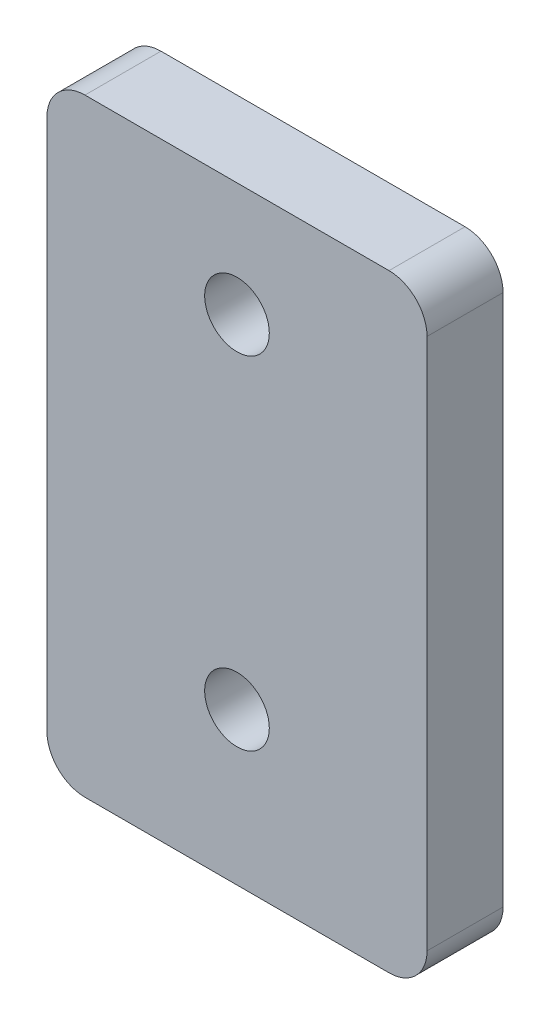
ISO-10303-21;
HEADER;
FILE_DESCRIPTION(('STEP AP214'),'2;1');
FILE_NAME('part.step','',(''),(''),'','','');
FILE_SCHEMA(('AUTOMOTIVE_DESIGN { 1 0 10303 214 1 1 1 1 }'));
ENDSEC;
DATA;
#1=APPLICATION_CONTEXT('core data for automotive mechanical design processes');
#2=APPLICATION_PROTOCOL_DEFINITION('international standard','automotive_design',2000,#1);
#3=PRODUCT_CONTEXT('',#1,'mechanical');
#4=PRODUCT('Part','Part','',(#3));
#5=PRODUCT_RELATED_PRODUCT_CATEGORY('part','',(#4));
#6=PRODUCT_DEFINITION_FORMATION('','',#4);
#7=PRODUCT_DEFINITION_CONTEXT('part definition',#1,'design');
#8=PRODUCT_DEFINITION('design','',#6,#7);
#9=PRODUCT_DEFINITION_SHAPE('','',#8);
#10=(LENGTH_UNIT() NAMED_UNIT(*) SI_UNIT(.MILLI.,.METRE.));
#11=(NAMED_UNIT(*) PLANE_ANGLE_UNIT() SI_UNIT($,.RADIAN.));
#12=(NAMED_UNIT(*) SI_UNIT($,.STERADIAN.) SOLID_ANGLE_UNIT());
#13=UNCERTAINTY_MEASURE_WITH_UNIT(LENGTH_MEASURE(1.E-05),#10,'distance_accuracy_value','');
#14=(GEOMETRIC_REPRESENTATION_CONTEXT(3) GLOBAL_UNCERTAINTY_ASSIGNED_CONTEXT((#13)) GLOBAL_UNIT_ASSIGNED_CONTEXT((#10,
#11,#12)) REPRESENTATION_CONTEXT('',''));
#15=CARTESIAN_POINT('',(0.,0.,0.));
#16=DIRECTION('',(0.,0.,1.));
#17=DIRECTION('',(1.,0.,0.));
#18=AXIS2_PLACEMENT_3D('',#15,#16,#17);
#19=CARTESIAN_POINT('',(25.,40.,-10.));
#20=DIRECTION('',(1.,0.,0.));
#21=DIRECTION('',(0.,1.,0.));
#22=AXIS2_PLACEMENT_3D('',#19,#20,#21);
#23=PLANE('',#22);
#24=DIRECTION('',(0.,1.,0.));
#25=VECTOR('',#24,1.);
#26=CARTESIAN_POINT('',(25.,40.,0.));
#27=LINE('',#26,#25);
#28=CARTESIAN_POINT('',(25.,-35.,0.));
#29=VERTEX_POINT('',#28);
#30=CARTESIAN_POINT('',(25.,35.,0.));
#31=VERTEX_POINT('',#30);
#32=EDGE_CURVE('E166',#29,#31,#27,.T.);
#33=ORIENTED_EDGE('',*,*,#32,.F.);
#34=DIRECTION('',(0.,0.,1.));
#35=VECTOR('',#34,1.);
#36=CARTESIAN_POINT('',(25.,-35.,-10.));
#37=LINE('',#36,#35);
#38=CARTESIAN_POINT('',(25.,-35.,-10.));
#39=VERTEX_POINT('',#38);
#40=EDGE_CURVE('E146',#29,#39,#37,.F.);
#41=ORIENTED_EDGE('',*,*,#40,.T.);
#42=DIRECTION('',(0.,1.,0.));
#43=VECTOR('',#42,1.);
#44=CARTESIAN_POINT('',(25.,40.,-10.));
#45=LINE('',#44,#43);
#46=CARTESIAN_POINT('',(25.,35.,-10.));
#47=VERTEX_POINT('',#46);
#48=EDGE_CURVE('E127',#39,#47,#45,.T.);
#49=ORIENTED_EDGE('',*,*,#48,.T.);
#50=DIRECTION('',(0.,0.,1.));
#51=VECTOR('',#50,1.);
#52=CARTESIAN_POINT('',(25.,35.,-10.));
#53=LINE('',#52,#51);
#54=EDGE_CURVE('E143',#47,#31,#53,.T.);
#55=ORIENTED_EDGE('',*,*,#54,.T.);
#56=EDGE_LOOP('',(#33,#41,#49,#55));
#57=FACE_BOUND('',#56,.T.);
#58=ADVANCED_FACE('F40',(#57),#23,.T.);
#59=CARTESIAN_POINT('',(-25.,-40.,-10.));
#60=DIRECTION('',(0.,-1.,0.));
#61=DIRECTION('',(0.,0.,-1.));
#62=AXIS2_PLACEMENT_3D('',#59,#60,#61);
#63=PLANE('',#62);
#64=DIRECTION('',(1.,0.,0.));
#65=VECTOR('',#64,1.);
#66=CARTESIAN_POINT('',(-25.,-40.,-10.));
#67=LINE('',#66,#65);
#68=CARTESIAN_POINT('',(-20.,-40.,-10.));
#69=VERTEX_POINT('',#68);
#70=CARTESIAN_POINT('',(20.,-40.,-10.));
#71=VERTEX_POINT('',#70);
#72=EDGE_CURVE('E132',#69,#71,#67,.T.);
#73=ORIENTED_EDGE('',*,*,#72,.T.);
#74=DIRECTION('',(0.,0.,1.));
#75=VECTOR('',#74,1.);
#76=CARTESIAN_POINT('',(20.,-40.,-10.));
#77=LINE('',#76,#75);
#78=CARTESIAN_POINT('',(20.,-40.,0.));
#79=VERTEX_POINT('',#78);
#80=EDGE_CURVE('E126',#71,#79,#77,.T.);
#81=ORIENTED_EDGE('',*,*,#80,.T.);
#82=DIRECTION('',(1.,0.,0.));
#83=VECTOR('',#82,1.);
#84=CARTESIAN_POINT('',(-25.,-40.,0.));
#85=LINE('',#84,#83);
#86=CARTESIAN_POINT('',(-20.,-40.,0.));
#87=VERTEX_POINT('',#86);
#88=EDGE_CURVE('E109',#87,#79,#85,.T.);
#89=ORIENTED_EDGE('',*,*,#88,.F.);
#90=DIRECTION('',(0.,0.,1.));
#91=VECTOR('',#90,1.);
#92=CARTESIAN_POINT('',(-20.,-40.,-10.));
#93=LINE('',#92,#91);
#94=EDGE_CURVE('E123',#87,#69,#93,.F.);
#95=ORIENTED_EDGE('',*,*,#94,.T.);
#96=EDGE_LOOP('',(#73,#81,#89,#95));
#97=FACE_BOUND('',#96,.T.);
#98=ADVANCED_FACE('F122',(#97),#63,.T.);
#99=CARTESIAN_POINT('',(-25.,40.,-10.));
#100=DIRECTION('',(-1.,0.,0.));
#101=DIRECTION('',(0.,-1.,0.));
#102=AXIS2_PLACEMENT_3D('',#99,#100,#101);
#103=PLANE('',#102);
#104=DIRECTION('',(0.,-1.,0.));
#105=VECTOR('',#104,1.);
#106=CARTESIAN_POINT('',(-25.,40.,-10.));
#107=LINE('',#106,#105);
#108=CARTESIAN_POINT('',(-25.,35.,-10.));
#109=VERTEX_POINT('',#108);
#110=CARTESIAN_POINT('',(-25.,-35.,-10.));
#111=VERTEX_POINT('',#110);
#112=EDGE_CURVE('E136',#109,#111,#107,.T.);
#113=ORIENTED_EDGE('',*,*,#112,.T.);
#114=DIRECTION('',(0.,0.,1.));
#115=VECTOR('',#114,1.);
#116=CARTESIAN_POINT('',(-25.,-35.,-10.));
#117=LINE('',#116,#115);
#118=CARTESIAN_POINT('',(-25.,-35.,0.));
#119=VERTEX_POINT('',#118);
#120=EDGE_CURVE('E156',#111,#119,#117,.T.);
#121=ORIENTED_EDGE('',*,*,#120,.T.);
#122=DIRECTION('',(0.,-1.,0.));
#123=VECTOR('',#122,1.);
#124=CARTESIAN_POINT('',(-25.,40.,0.));
#125=LINE('',#124,#123);
#126=CARTESIAN_POINT('',(-25.,35.,0.));
#127=VERTEX_POINT('',#126);
#128=EDGE_CURVE('E111',#127,#119,#125,.T.);
#129=ORIENTED_EDGE('',*,*,#128,.F.);
#130=DIRECTION('',(0.,0.,1.));
#131=VECTOR('',#130,1.);
#132=CARTESIAN_POINT('',(-25.,35.,-10.));
#133=LINE('',#132,#131);
#134=EDGE_CURVE('E154',#127,#109,#133,.F.);
#135=ORIENTED_EDGE('',*,*,#134,.T.);
#136=EDGE_LOOP('',(#113,#121,#129,#135));
#137=FACE_BOUND('',#136,.T.);
#138=ADVANCED_FACE('F159',(#137),#103,.T.);
#139=CARTESIAN_POINT('',(-25.,40.,-10.));
#140=DIRECTION('',(0.,1.,0.));
#141=DIRECTION('',(0.,0.,1.));
#142=AXIS2_PLACEMENT_3D('',#139,#140,#141);
#143=PLANE('',#142);
#144=DIRECTION('',(-1.,0.,0.));
#145=VECTOR('',#144,1.);
#146=CARTESIAN_POINT('',(-25.,40.,-10.));
#147=LINE('',#146,#145);
#148=CARTESIAN_POINT('',(20.,40.,-10.));
#149=VERTEX_POINT('',#148);
#150=CARTESIAN_POINT('',(-20.,40.,-10.));
#151=VERTEX_POINT('',#150);
#152=EDGE_CURVE('E161',#149,#151,#147,.T.);
#153=ORIENTED_EDGE('',*,*,#152,.T.);
#154=DIRECTION('',(0.,0.,1.));
#155=VECTOR('',#154,1.);
#156=CARTESIAN_POINT('',(-20.,40.,-10.));
#157=LINE('',#156,#155);
#158=CARTESIAN_POINT('',(-20.,40.,0.));
#159=VERTEX_POINT('',#158);
#160=EDGE_CURVE('E11',#151,#159,#157,.T.);
#161=ORIENTED_EDGE('',*,*,#160,.T.);
#162=DIRECTION('',(-1.,0.,0.));
#163=VECTOR('',#162,1.);
#164=CARTESIAN_POINT('',(-25.,40.,0.));
#165=LINE('',#164,#163);
#166=CARTESIAN_POINT('',(20.,40.,0.));
#167=VERTEX_POINT('',#166);
#168=EDGE_CURVE('E169',#167,#159,#165,.T.);
#169=ORIENTED_EDGE('',*,*,#168,.F.);
#170=DIRECTION('',(0.,0.,1.));
#171=VECTOR('',#170,1.);
#172=CARTESIAN_POINT('',(20.,40.,-10.));
#173=LINE('',#172,#171);
#174=EDGE_CURVE('E48',#167,#149,#173,.F.);
#175=ORIENTED_EDGE('',*,*,#174,.T.);
#176=EDGE_LOOP('',(#153,#161,#169,#175));
#177=FACE_BOUND('',#176,.T.);
#178=ADVANCED_FACE('F172',(#177),#143,.T.);
#179=CARTESIAN_POINT('',(0.,0.,-10.));
#180=DIRECTION('',(0.,0.,1.));
#181=DIRECTION('',(1.,0.,0.));
#182=AXIS2_PLACEMENT_3D('',#179,#180,#181);
#183=PLANE('',#182);
#184=CARTESIAN_POINT('',(0.,25.,-10.));
#185=DIRECTION('',(0.,0.,1.));
#186=DIRECTION('',(1.,0.,0.));
#187=AXIS2_PLACEMENT_3D('',#184,#185,#186);
#188=CIRCLE('',#187,4.25);
#189=CARTESIAN_POINT('',(4.25,25.,-10.));
#190=VERTEX_POINT('',#189);
#191=EDGE_CURVE('E170',#190,#190,#188,.T.);
#192=ORIENTED_EDGE('',*,*,#191,.T.);
#193=EDGE_LOOP('',(#192));
#194=FACE_BOUND('',#193,.T.);
#195=CARTESIAN_POINT('',(0.,-20.,-10.));
#196=DIRECTION('',(0.,0.,1.));
#197=DIRECTION('',(1.,0.,0.));
#198=AXIS2_PLACEMENT_3D('',#195,#196,#197);
#199=CIRCLE('',#198,4.25);
#200=CARTESIAN_POINT('',(4.25,-20.,-10.));
#201=VERTEX_POINT('',#200);
#202=EDGE_CURVE('E187',#201,#201,#199,.T.);
#203=ORIENTED_EDGE('',*,*,#202,.T.);
#204=EDGE_LOOP('',(#203));
#205=FACE_BOUND('',#204,.T.);
#206=ORIENTED_EDGE('',*,*,#48,.F.);
#207=CARTESIAN_POINT('',(20.,-35.,-10.));
#208=DIRECTION('',(0.,0.,1.));
#209=DIRECTION('',(1.,0.,0.));
#210=AXIS2_PLACEMENT_3D('',#207,#208,#209);
#211=CIRCLE('',#210,5.);
#212=EDGE_CURVE('E152',#39,#71,#211,.F.);
#213=ORIENTED_EDGE('',*,*,#212,.T.);
#214=ORIENTED_EDGE('',*,*,#72,.F.);
#215=CARTESIAN_POINT('',(-20.,-35.,-10.));
#216=DIRECTION('',(0.,0.,1.));
#217=DIRECTION('',(1.,0.,0.));
#218=AXIS2_PLACEMENT_3D('',#215,#216,#217);
#219=CIRCLE('',#218,5.);
#220=EDGE_CURVE('E131',#69,#111,#219,.F.);
#221=ORIENTED_EDGE('',*,*,#220,.T.);
#222=ORIENTED_EDGE('',*,*,#112,.F.);
#223=CARTESIAN_POINT('',(-20.,35.,-10.));
#224=DIRECTION('',(0.,0.,1.));
#225=DIRECTION('',(1.,0.,0.));
#226=AXIS2_PLACEMENT_3D('',#223,#224,#225);
#227=CIRCLE('',#226,5.);
#228=EDGE_CURVE('E55',#109,#151,#227,.F.);
#229=ORIENTED_EDGE('',*,*,#228,.T.);
#230=ORIENTED_EDGE('',*,*,#152,.F.);
#231=CARTESIAN_POINT('',(20.,35.,-10.));
#232=DIRECTION('',(0.,0.,1.));
#233=DIRECTION('',(1.,0.,0.));
#234=AXIS2_PLACEMENT_3D('',#231,#232,#233);
#235=CIRCLE('',#234,5.);
#236=EDGE_CURVE('E148',#149,#47,#235,.F.);
#237=ORIENTED_EDGE('',*,*,#236,.T.);
#238=EDGE_LOOP('',(#206,#213,#214,#221,#222,#229,#230,#237));
#239=FACE_BOUND('',#238,.T.);
#240=ADVANCED_FACE('F179',(#194,#205,#239),#183,.F.);
#241=CARTESIAN_POINT('',(0.,0.,0.));
#242=DIRECTION('',(0.,0.,1.));
#243=DIRECTION('',(1.,0.,0.));
#244=AXIS2_PLACEMENT_3D('',#241,#242,#243);
#245=PLANE('',#244);
#246=CARTESIAN_POINT('',(0.,25.,0.));
#247=DIRECTION('',(0.,0.,1.));
#248=DIRECTION('',(1.,0.,0.));
#249=AXIS2_PLACEMENT_3D('',#246,#247,#248);
#250=CIRCLE('',#249,4.25);
#251=CARTESIAN_POINT('',(4.25,25.,0.));
#252=VERTEX_POINT('',#251);
#253=EDGE_CURVE('E190',#252,#252,#250,.T.);
#254=ORIENTED_EDGE('',*,*,#253,.F.);
#255=EDGE_LOOP('',(#254));
#256=FACE_BOUND('',#255,.T.);
#257=CARTESIAN_POINT('',(0.,-20.,0.));
#258=DIRECTION('',(0.,0.,1.));
#259=DIRECTION('',(1.,0.,0.));
#260=AXIS2_PLACEMENT_3D('',#257,#258,#259);
#261=CIRCLE('',#260,4.25);
#262=CARTESIAN_POINT('',(4.25,-20.,0.));
#263=VERTEX_POINT('',#262);
#264=EDGE_CURVE('E191',#263,#263,#261,.T.);
#265=ORIENTED_EDGE('',*,*,#264,.F.);
#266=EDGE_LOOP('',(#265));
#267=FACE_BOUND('',#266,.T.);
#268=ORIENTED_EDGE('',*,*,#88,.T.);
#269=CARTESIAN_POINT('',(20.,-35.,0.));
#270=DIRECTION('',(0.,0.,1.));
#271=DIRECTION('',(1.,0.,0.));
#272=AXIS2_PLACEMENT_3D('',#269,#270,#271);
#273=CIRCLE('',#272,5.);
#274=EDGE_CURVE('E116',#79,#29,#273,.T.);
#275=ORIENTED_EDGE('',*,*,#274,.T.);
#276=ORIENTED_EDGE('',*,*,#32,.T.);
#277=CARTESIAN_POINT('',(20.,35.,0.));
#278=DIRECTION('',(0.,0.,1.));
#279=DIRECTION('',(1.,0.,0.));
#280=AXIS2_PLACEMENT_3D('',#277,#278,#279);
#281=CIRCLE('',#280,5.);
#282=EDGE_CURVE('E134',#31,#167,#281,.T.);
#283=ORIENTED_EDGE('',*,*,#282,.T.);
#284=ORIENTED_EDGE('',*,*,#168,.T.);
#285=CARTESIAN_POINT('',(-20.,35.,0.));
#286=DIRECTION('',(0.,0.,1.));
#287=DIRECTION('',(1.,0.,0.));
#288=AXIS2_PLACEMENT_3D('',#285,#286,#287);
#289=CIRCLE('',#288,5.);
#290=EDGE_CURVE('E117',#159,#127,#289,.T.);
#291=ORIENTED_EDGE('',*,*,#290,.T.);
#292=ORIENTED_EDGE('',*,*,#128,.T.);
#293=CARTESIAN_POINT('',(-20.,-35.,0.));
#294=DIRECTION('',(0.,0.,1.));
#295=DIRECTION('',(1.,0.,0.));
#296=AXIS2_PLACEMENT_3D('',#293,#294,#295);
#297=CIRCLE('',#296,5.);
#298=EDGE_CURVE('E106',#119,#87,#297,.T.);
#299=ORIENTED_EDGE('',*,*,#298,.T.);
#300=EDGE_LOOP('',(#268,#275,#276,#283,#284,#291,#292,#299));
#301=FACE_BOUND('',#300,.T.);
#302=ADVANCED_FACE('F108',(#256,#267,#301),#245,.T.);
#303=CARTESIAN_POINT('',(0.,-20.,-20.));
#304=DIRECTION('',(0.,0.,1.));
#305=DIRECTION('',(1.,0.,0.));
#306=AXIS2_PLACEMENT_3D('',#303,#304,#305);
#307=CYLINDRICAL_SURFACE('',#306,4.25);
#308=ORIENTED_EDGE('',*,*,#264,.T.);
#309=EDGE_LOOP('',(#308));
#310=FACE_BOUND('',#309,.T.);
#311=ORIENTED_EDGE('',*,*,#202,.F.);
#312=EDGE_LOOP('',(#311));
#313=FACE_BOUND('',#312,.T.);
#314=ADVANCED_FACE('F202',(#310,#313),#307,.F.);
#315=CARTESIAN_POINT('',(0.,25.,-20.));
#316=DIRECTION('',(0.,0.,1.));
#317=DIRECTION('',(1.,0.,0.));
#318=AXIS2_PLACEMENT_3D('',#315,#316,#317);
#319=CYLINDRICAL_SURFACE('',#318,4.25);
#320=ORIENTED_EDGE('',*,*,#253,.T.);
#321=EDGE_LOOP('',(#320));
#322=FACE_BOUND('',#321,.T.);
#323=ORIENTED_EDGE('',*,*,#191,.F.);
#324=EDGE_LOOP('',(#323));
#325=FACE_BOUND('',#324,.T.);
#326=ADVANCED_FACE('F197',(#322,#325),#319,.F.);
#327=CARTESIAN_POINT('',(20.,-35.,-10.));
#328=DIRECTION('',(0.,0.,1.));
#329=DIRECTION('',(1.,0.,0.));
#330=AXIS2_PLACEMENT_3D('',#327,#328,#329);
#331=CYLINDRICAL_SURFACE('',#330,5.);
#332=ORIENTED_EDGE('',*,*,#212,.F.);
#333=ORIENTED_EDGE('',*,*,#40,.F.);
#334=ORIENTED_EDGE('',*,*,#274,.F.);
#335=ORIENTED_EDGE('',*,*,#80,.F.);
#336=EDGE_LOOP('',(#332,#333,#334,#335));
#337=FACE_BOUND('',#336,.T.);
#338=ADVANCED_FACE('F226',(#337),#331,.T.);
#339=CARTESIAN_POINT('',(-20.,-35.,-10.));
#340=DIRECTION('',(0.,0.,1.));
#341=DIRECTION('',(1.,0.,0.));
#342=AXIS2_PLACEMENT_3D('',#339,#340,#341);
#343=CYLINDRICAL_SURFACE('',#342,5.);
#344=ORIENTED_EDGE('',*,*,#220,.F.);
#345=ORIENTED_EDGE('',*,*,#94,.F.);
#346=ORIENTED_EDGE('',*,*,#298,.F.);
#347=ORIENTED_EDGE('',*,*,#120,.F.);
#348=EDGE_LOOP('',(#344,#345,#346,#347));
#349=FACE_BOUND('',#348,.T.);
#350=ADVANCED_FACE('F130',(#349),#343,.T.);
#351=CARTESIAN_POINT('',(-20.,35.,-10.));
#352=DIRECTION('',(0.,0.,1.));
#353=DIRECTION('',(1.,0.,0.));
#354=AXIS2_PLACEMENT_3D('',#351,#352,#353);
#355=CYLINDRICAL_SURFACE('',#354,5.);
#356=ORIENTED_EDGE('',*,*,#228,.F.);
#357=ORIENTED_EDGE('',*,*,#134,.F.);
#358=ORIENTED_EDGE('',*,*,#290,.F.);
#359=ORIENTED_EDGE('',*,*,#160,.F.);
#360=EDGE_LOOP('',(#356,#357,#358,#359));
#361=FACE_BOUND('',#360,.T.);
#362=ADVANCED_FACE('F231',(#361),#355,.T.);
#363=CARTESIAN_POINT('',(20.,35.,-10.));
#364=DIRECTION('',(0.,0.,1.));
#365=DIRECTION('',(1.,0.,0.));
#366=AXIS2_PLACEMENT_3D('',#363,#364,#365);
#367=CYLINDRICAL_SURFACE('',#366,5.);
#368=ORIENTED_EDGE('',*,*,#236,.F.);
#369=ORIENTED_EDGE('',*,*,#174,.F.);
#370=ORIENTED_EDGE('',*,*,#282,.F.);
#371=ORIENTED_EDGE('',*,*,#54,.F.);
#372=EDGE_LOOP('',(#368,#369,#370,#371));
#373=FACE_BOUND('',#372,.T.);
#374=ADVANCED_FACE('F42',(#373),#367,.T.);
#375=CLOSED_SHELL('',(#58,#98,#138,#178,#240,#302,#314,#326,#338,#350,#362,#374));
#376=MANIFOLD_SOLID_BREP('B2',#375);
#377=ADVANCED_BREP_SHAPE_REPRESENTATION('',(#18,#376),#14);
#378=SHAPE_DEFINITION_REPRESENTATION(#9,#377);
ENDSEC;
END-ISO-10303-21;
